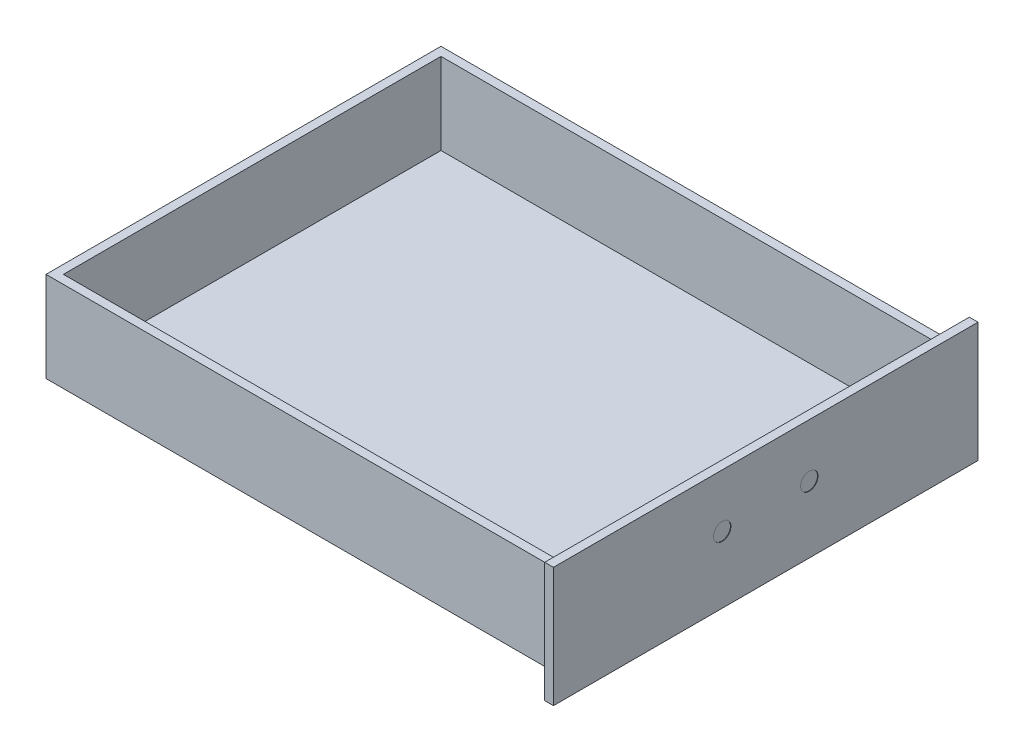
ISO-10303-21;
HEADER;
FILE_DESCRIPTION(('STEP AP214'),'2;1');
FILE_NAME('part.step','',(''),(''),'','','');
FILE_SCHEMA(('AUTOMOTIVE_DESIGN { 1 0 10303 214 1 1 1 1 }'));
ENDSEC;
DATA;
#1=APPLICATION_CONTEXT('core data for automotive mechanical design processes');
#2=APPLICATION_PROTOCOL_DEFINITION('international standard','automotive_design',2000,#1);
#3=PRODUCT_CONTEXT('',#1,'mechanical');
#4=PRODUCT('Part','Part','',(#3));
#5=PRODUCT_RELATED_PRODUCT_CATEGORY('part','',(#4));
#6=PRODUCT_DEFINITION_FORMATION('','',#4);
#7=PRODUCT_DEFINITION_CONTEXT('part definition',#1,'design');
#8=PRODUCT_DEFINITION('design','',#6,#7);
#9=PRODUCT_DEFINITION_SHAPE('','',#8);
#10=(LENGTH_UNIT() NAMED_UNIT(*) SI_UNIT(.MILLI.,.METRE.));
#11=(NAMED_UNIT(*) PLANE_ANGLE_UNIT() SI_UNIT($,.RADIAN.));
#12=(NAMED_UNIT(*) SI_UNIT($,.STERADIAN.) SOLID_ANGLE_UNIT());
#13=UNCERTAINTY_MEASURE_WITH_UNIT(LENGTH_MEASURE(1.E-05),#10,'distance_accuracy_value','');
#14=(GEOMETRIC_REPRESENTATION_CONTEXT(3) GLOBAL_UNCERTAINTY_ASSIGNED_CONTEXT((#13)) GLOBAL_UNIT_ASSIGNED_CONTEXT((#10,
#11,#12)) REPRESENTATION_CONTEXT('',''));
#15=CARTESIAN_POINT('',(0.,0.,0.));
#16=DIRECTION('',(0.,0.,1.));
#17=DIRECTION('',(1.,0.,0.));
#18=AXIS2_PLACEMENT_3D('',#15,#16,#17);
#19=CARTESIAN_POINT('',(-600.,1.89241402487911E-12,-340.907003891051));
#20=DIRECTION('',(0.,0.,-1.));
#21=DIRECTION('',(0.,1.,0.));
#22=AXIS2_PLACEMENT_3D('',#19,#20,#21);
#23=PLANE('',#22);
#24=DIRECTION('',(0.,1.,0.));
#25=VECTOR('',#24,1.);
#26=CARTESIAN_POINT('',(-590.,1.89241402487911E-12,-340.907003891051));
#27=LINE('',#26,#25);
#28=CARTESIAN_POINT('',(-590.,-49.5165369649805,-340.907003891051));
#29=VERTEX_POINT('',#28);
#30=CARTESIAN_POINT('',(-590.,44.1834630350195,-340.907003891051));
#31=VERTEX_POINT('',#30);
#32=EDGE_CURVE('E137',#29,#31,#27,.T.);
#33=ORIENTED_EDGE('',*,*,#32,.F.);
#34=DIRECTION('',(1.,0.,0.));
#35=VECTOR('',#34,1.);
#36=CARTESIAN_POINT('',(-600.,-49.5165369649805,-340.907003891051));
#37=LINE('',#36,#35);
#38=CARTESIAN_POINT('',(-10.,-49.5165369649805,-340.907003891051));
#39=VERTEX_POINT('',#38);
#40=EDGE_CURVE('E57',#29,#39,#37,.T.);
#41=ORIENTED_EDGE('',*,*,#40,.T.);
#42=DIRECTION('',(0.,1.,0.));
#43=VECTOR('',#42,1.);
#44=CARTESIAN_POINT('',(-10.,44.1834630350195,-340.907003891051));
#45=LINE('',#44,#43);
#46=CARTESIAN_POINT('',(-9.9999999999999,44.1834630350195,-340.90700389105));
#47=VERTEX_POINT('',#46);
#48=EDGE_CURVE('E263',#39,#47,#45,.T.);
#49=ORIENTED_EDGE('',*,*,#48,.T.);
#50=DIRECTION('',(1.,0.,0.));
#51=VECTOR('',#50,1.);
#52=CARTESIAN_POINT('',(-600.,44.1834630350195,-340.907003891051));
#53=LINE('',#52,#51);
#54=EDGE_CURVE('E164',#31,#47,#53,.T.);
#55=ORIENTED_EDGE('',*,*,#54,.F.);
#56=EDGE_LOOP('',(#33,#41,#49,#55));
#57=FACE_BOUND('',#56,.T.);
#58=ADVANCED_FACE('F40',(#57),#23,.F.);
#59=CARTESIAN_POINT('',(-600.,0.,92.8929961089494));
#60=DIRECTION('',(0.,0.,1.));
#61=DIRECTION('',(0.,-1.,0.));
#62=AXIS2_PLACEMENT_3D('',#59,#60,#61);
#63=PLANE('',#62);
#64=DIRECTION('',(0.,-1.,0.));
#65=VECTOR('',#64,1.);
#66=CARTESIAN_POINT('',(-590.,0.,92.8929961089494));
#67=LINE('',#66,#65);
#68=CARTESIAN_POINT('',(-590.,44.1834630350195,92.8929961089493));
#69=VERTEX_POINT('',#68);
#70=CARTESIAN_POINT('',(-590.,-49.5165369649805,92.8929961089494));
#71=VERTEX_POINT('',#70);
#72=EDGE_CURVE('E135',#69,#71,#67,.T.);
#73=ORIENTED_EDGE('',*,*,#72,.F.);
#74=DIRECTION('',(1.,0.,0.));
#75=VECTOR('',#74,1.);
#76=CARTESIAN_POINT('',(-600.,44.1834630350195,92.8929961089494));
#77=LINE('',#76,#75);
#78=CARTESIAN_POINT('',(-9.9999999999999,44.1834630350195,92.8929961089494));
#79=VERTEX_POINT('',#78);
#80=EDGE_CURVE('E65',#69,#79,#77,.T.);
#81=ORIENTED_EDGE('',*,*,#80,.T.);
#82=DIRECTION('',(0.,-1.,0.));
#83=VECTOR('',#82,1.);
#84=CARTESIAN_POINT('',(-10.,44.1834630350195,92.8929961089494));
#85=LINE('',#84,#83);
#86=CARTESIAN_POINT('',(-10.,-49.5165369649805,92.8929961089494));
#87=VERTEX_POINT('',#86);
#88=EDGE_CURVE('E259',#79,#87,#85,.T.);
#89=ORIENTED_EDGE('',*,*,#88,.T.);
#90=DIRECTION('',(1.,0.,0.));
#91=VECTOR('',#90,1.);
#92=CARTESIAN_POINT('',(-600.,-49.5165369649805,92.8929961089494));
#93=LINE('',#92,#91);
#94=EDGE_CURVE('E145',#71,#87,#93,.T.);
#95=ORIENTED_EDGE('',*,*,#94,.F.);
#96=EDGE_LOOP('',(#73,#81,#89,#95));
#97=FACE_BOUND('',#96,.T.);
#98=ADVANCED_FACE('F144',(#97),#63,.F.);
#99=CARTESIAN_POINT('',(-600.,-49.5165369649805,0.));
#100=DIRECTION('',(0.,-1.,0.));
#101=DIRECTION('',(0.,0.,-1.));
#102=AXIS2_PLACEMENT_3D('',#99,#100,#101);
#103=PLANE('',#102);
#104=DIRECTION('',(0.,0.,-1.));
#105=VECTOR('',#104,1.);
#106=CARTESIAN_POINT('',(-590.,-49.5165369649805,0.));
#107=LINE('',#106,#105);
#108=EDGE_CURVE('E140',#71,#29,#107,.T.);
#109=ORIENTED_EDGE('',*,*,#108,.F.);
#110=ORIENTED_EDGE('',*,*,#94,.T.);
#111=DIRECTION('',(0.,0.,-1.));
#112=VECTOR('',#111,1.);
#113=CARTESIAN_POINT('',(-10.,-49.5165369649805,92.8929961089494));
#114=LINE('',#113,#112);
#115=EDGE_CURVE('E261',#87,#39,#114,.T.);
#116=ORIENTED_EDGE('',*,*,#115,.T.);
#117=ORIENTED_EDGE('',*,*,#40,.F.);
#118=EDGE_LOOP('',(#109,#110,#116,#117));
#119=FACE_BOUND('',#118,.T.);
#120=ADVANCED_FACE('F229',(#119),#103,.F.);
#121=CARTESIAN_POINT('',(-9.9999999999999,61.1834630350195,119.892996108949));
#122=DIRECTION('',(0.,0.,1.));
#123=DIRECTION('',(1.,0.,0.));
#124=AXIS2_PLACEMENT_3D('',#121,#122,#123);
#125=PLANE('',#124);
#126=DIRECTION('',(0.,-1.,0.));
#127=VECTOR('',#126,1.);
#128=CARTESIAN_POINT('',(0.,61.1834630350195,119.892996108949));
#129=LINE('',#128,#127);
#130=CARTESIAN_POINT('',(0.,61.1834630350195,119.892996108949));
#131=VERTEX_POINT('',#130);
#132=CARTESIAN_POINT('',(0.,-76.5165369649805,119.892996108949));
#133=VERTEX_POINT('',#132);
#134=EDGE_CURVE('E173',#131,#133,#129,.T.);
#135=ORIENTED_EDGE('',*,*,#134,.F.);
#136=DIRECTION('',(1.,0.,0.));
#137=VECTOR('',#136,1.);
#138=CARTESIAN_POINT('',(-9.9999999999999,61.1834630350195,119.892996108949));
#139=LINE('',#138,#137);
#140=CARTESIAN_POINT('',(-9.9999999999999,61.1834630350195,119.892996108949));
#141=VERTEX_POINT('',#140);
#142=EDGE_CURVE('E11',#141,#131,#139,.T.);
#143=ORIENTED_EDGE('',*,*,#142,.F.);
#144=DIRECTION('',(0.,-1.,0.));
#145=VECTOR('',#144,1.);
#146=CARTESIAN_POINT('',(-9.9999999999999,61.1834630350195,119.892996108949));
#147=LINE('',#146,#145);
#148=CARTESIAN_POINT('',(-9.9999999999999,-76.5165369649805,119.892996108949));
#149=VERTEX_POINT('',#148);
#150=EDGE_CURVE('E174',#141,#149,#147,.T.);
#151=ORIENTED_EDGE('',*,*,#150,.T.);
#152=DIRECTION('',(1.,0.,0.));
#153=VECTOR('',#152,1.);
#154=CARTESIAN_POINT('',(-9.9999999999999,-76.5165369649805,119.892996108949));
#155=LINE('',#154,#153);
#156=EDGE_CURVE('E44',#149,#133,#155,.T.);
#157=ORIENTED_EDGE('',*,*,#156,.T.);
#158=EDGE_LOOP('',(#135,#143,#151,#157));
#159=FACE_BOUND('',#158,.T.);
#160=ADVANCED_FACE('F42',(#159),#125,.T.);
#161=CARTESIAN_POINT('',(-9.9999999999999,61.1834630350195,119.892996108949));
#162=DIRECTION('',(0.,1.,0.));
#163=DIRECTION('',(0.,0.,1.));
#164=AXIS2_PLACEMENT_3D('',#161,#162,#163);
#165=PLANE('',#164);
#166=DIRECTION('',(0.,0.,1.));
#167=VECTOR('',#166,1.);
#168=CARTESIAN_POINT('',(0.,61.1834630350195,119.892996108949));
#169=LINE('',#168,#167);
#170=CARTESIAN_POINT('',(0.,61.1834630350195,-367.907003891051));
#171=VERTEX_POINT('',#170);
#172=EDGE_CURVE('E178',#171,#131,#169,.T.);
#173=ORIENTED_EDGE('',*,*,#172,.F.);
#174=DIRECTION('',(1.,0.,0.));
#175=VECTOR('',#174,1.);
#176=CARTESIAN_POINT('',(-9.9999999999999,61.1834630350195,-367.907003891051));
#177=LINE('',#176,#175);
#178=CARTESIAN_POINT('',(-9.9999999999999,61.1834630350195,-367.907003891051));
#179=VERTEX_POINT('',#178);
#180=EDGE_CURVE('E49',#179,#171,#177,.T.);
#181=ORIENTED_EDGE('',*,*,#180,.F.);
#182=DIRECTION('',(0.,0.,1.));
#183=VECTOR('',#182,1.);
#184=CARTESIAN_POINT('',(-9.9999999999999,61.1834630350195,119.892996108949));
#185=LINE('',#184,#183);
#186=EDGE_CURVE('E184',#179,#141,#185,.T.);
#187=ORIENTED_EDGE('',*,*,#186,.T.);
#188=ORIENTED_EDGE('',*,*,#142,.T.);
#189=EDGE_LOOP('',(#173,#181,#187,#188));
#190=FACE_BOUND('',#189,.T.);
#191=ADVANCED_FACE('F210',(#190),#165,.T.);
#192=CARTESIAN_POINT('',(-9.9999999999999,61.1834630350195,-367.907003891051));
#193=DIRECTION('',(0.,0.,-1.));
#194=DIRECTION('',(-1.,0.,0.));
#195=AXIS2_PLACEMENT_3D('',#192,#193,#194);
#196=PLANE('',#195);
#197=DIRECTION('',(0.,1.,0.));
#198=VECTOR('',#197,1.);
#199=CARTESIAN_POINT('',(0.,61.1834630350195,-367.907003891051));
#200=LINE('',#199,#198);
#201=CARTESIAN_POINT('',(0.,-76.5165369649805,-367.907003891051));
#202=VERTEX_POINT('',#201);
#203=EDGE_CURVE('E192',#202,#171,#200,.T.);
#204=ORIENTED_EDGE('',*,*,#203,.F.);
#205=DIRECTION('',(1.,0.,0.));
#206=VECTOR('',#205,1.);
#207=CARTESIAN_POINT('',(-9.9999999999999,-76.5165369649805,-367.907003891051));
#208=LINE('',#207,#206);
#209=CARTESIAN_POINT('',(-9.9999999999999,-76.5165369649805,-367.907003891051));
#210=VERTEX_POINT('',#209);
#211=EDGE_CURVE('E197',#210,#202,#208,.T.);
#212=ORIENTED_EDGE('',*,*,#211,.F.);
#213=DIRECTION('',(0.,1.,0.));
#214=VECTOR('',#213,1.);
#215=CARTESIAN_POINT('',(-9.9999999999999,61.1834630350195,-367.907003891051));
#216=LINE('',#215,#214);
#217=EDGE_CURVE('E181',#210,#179,#216,.T.);
#218=ORIENTED_EDGE('',*,*,#217,.T.);
#219=ORIENTED_EDGE('',*,*,#180,.T.);
#220=EDGE_LOOP('',(#204,#212,#218,#219));
#221=FACE_BOUND('',#220,.T.);
#222=ADVANCED_FACE('F216',(#221),#196,.T.);
#223=CARTESIAN_POINT('',(-9.9999999999999,-76.5165369649805,119.892996108949));
#224=DIRECTION('',(0.,-1.,0.));
#225=DIRECTION('',(0.,0.,-1.));
#226=AXIS2_PLACEMENT_3D('',#223,#224,#225);
#227=PLANE('',#226);
#228=DIRECTION('',(0.,0.,-1.));
#229=VECTOR('',#228,1.);
#230=CARTESIAN_POINT('',(0.,-76.5165369649805,119.892996108949));
#231=LINE('',#230,#229);
#232=EDGE_CURVE('E189',#133,#202,#231,.T.);
#233=ORIENTED_EDGE('',*,*,#232,.F.);
#234=ORIENTED_EDGE('',*,*,#156,.F.);
#235=DIRECTION('',(0.,0.,-1.));
#236=VECTOR('',#235,1.);
#237=CARTESIAN_POINT('',(-9.9999999999999,-76.5165369649805,119.892996108949));
#238=LINE('',#237,#236);
#239=EDGE_CURVE('E177',#149,#210,#238,.T.);
#240=ORIENTED_EDGE('',*,*,#239,.T.);
#241=ORIENTED_EDGE('',*,*,#211,.T.);
#242=EDGE_LOOP('',(#233,#234,#240,#241));
#243=FACE_BOUND('',#242,.T.);
#244=ADVANCED_FACE('F205',(#243),#227,.T.);
#245=CARTESIAN_POINT('',(-9.9999999999999,0.,0.));
#246=DIRECTION('',(1.,0.,0.));
#247=DIRECTION('',(0.,0.,-1.));
#248=AXIS2_PLACEMENT_3D('',#245,#246,#247);
#249=PLANE('',#248);
#250=DIRECTION('',(0.,0.,1.));
#251=VECTOR('',#250,1.);
#252=CARTESIAN_POINT('',(-9.9999999999999,44.1834630350195,102.892996108949));
#253=LINE('',#252,#251);
#254=CARTESIAN_POINT('',(-9.9999999999999,44.1834630350195,-350.907003891051));
#255=VERTEX_POINT('',#254);
#256=EDGE_CURVE('E170',#255,#47,#253,.T.);
#257=ORIENTED_EDGE('',*,*,#256,.T.);
#258=ORIENTED_EDGE('',*,*,#48,.F.);
#259=ORIENTED_EDGE('',*,*,#115,.F.);
#260=ORIENTED_EDGE('',*,*,#88,.F.);
#261=CARTESIAN_POINT('',(-9.9999999999999,44.1834630350195,102.892996108949));
#262=VERTEX_POINT('',#261);
#263=EDGE_CURVE('E149',#79,#262,#253,.T.);
#264=ORIENTED_EDGE('',*,*,#263,.T.);
#265=DIRECTION('',(0.,-1.,0.));
#266=VECTOR('',#265,1.);
#267=CARTESIAN_POINT('',(-9.9999999999999,44.1834630350195,102.892996108949));
#268=LINE('',#267,#266);
#269=CARTESIAN_POINT('',(-9.9999999999999,-59.5165369649805,102.892996108949));
#270=VERTEX_POINT('',#269);
#271=EDGE_CURVE('E160',#262,#270,#268,.T.);
#272=ORIENTED_EDGE('',*,*,#271,.T.);
#273=DIRECTION('',(0.,0.,-1.));
#274=VECTOR('',#273,1.);
#275=CARTESIAN_POINT('',(-9.9999999999999,-59.5165369649805,102.892996108949));
#276=LINE('',#275,#274);
#277=CARTESIAN_POINT('',(-9.9999999999999,-59.5165369649805,-350.907003891051));
#278=VERTEX_POINT('',#277);
#279=EDGE_CURVE('E163',#270,#278,#276,.T.);
#280=ORIENTED_EDGE('',*,*,#279,.T.);
#281=DIRECTION('',(0.,1.,0.));
#282=VECTOR('',#281,1.);
#283=CARTESIAN_POINT('',(-9.9999999999999,44.1834630350195,-350.907003891051));
#284=LINE('',#283,#282);
#285=EDGE_CURVE('E167',#278,#255,#284,.T.);
#286=ORIENTED_EDGE('',*,*,#285,.T.);
#287=EDGE_LOOP('',(#257,#258,#259,#260,#264,#272,#280,#286));
#288=FACE_BOUND('',#287,.T.);
#289=ORIENTED_EDGE('',*,*,#150,.F.);
#290=ORIENTED_EDGE('',*,*,#186,.F.);
#291=ORIENTED_EDGE('',*,*,#217,.F.);
#292=ORIENTED_EDGE('',*,*,#239,.F.);
#293=EDGE_LOOP('',(#289,#290,#291,#292));
#294=FACE_BOUND('',#293,.T.);
#295=ADVANCED_FACE('F213',(#288,#294),#249,.F.);
#296=CARTESIAN_POINT('',(0.,0.,0.));
#297=DIRECTION('',(1.,0.,0.));
#298=DIRECTION('',(0.,0.,-1.));
#299=AXIS2_PLACEMENT_3D('',#296,#297,#298);
#300=PLANE('',#299);
#301=CARTESIAN_POINT('',(0.,0.,-74.0070038910507));
#302=DIRECTION('',(1.,0.,0.));
#303=DIRECTION('',(0.,0.,-1.));
#304=AXIS2_PLACEMENT_3D('',#301,#302,#303);
#305=CIRCLE('',#304,9.99999999999999);
#306=CARTESIAN_POINT('',(0.,0.,-84.0070038910507));
#307=VERTEX_POINT('',#306);
#308=EDGE_CURVE('E246',#307,#307,#305,.T.);
#309=ORIENTED_EDGE('',*,*,#308,.F.);
#310=EDGE_LOOP('',(#309));
#311=FACE_BOUND('',#310,.T.);
#312=CARTESIAN_POINT('',(0.,0.,-174.007003891051));
#313=DIRECTION('',(1.,0.,0.));
#314=DIRECTION('',(0.,0.,-1.));
#315=AXIS2_PLACEMENT_3D('',#312,#313,#314);
#316=CIRCLE('',#315,10.);
#317=CARTESIAN_POINT('',(0.,0.,-184.007003891051));
#318=VERTEX_POINT('',#317);
#319=EDGE_CURVE('E249',#318,#318,#316,.T.);
#320=ORIENTED_EDGE('',*,*,#319,.F.);
#321=EDGE_LOOP('',(#320));
#322=FACE_BOUND('',#321,.T.);
#323=ORIENTED_EDGE('',*,*,#134,.T.);
#324=ORIENTED_EDGE('',*,*,#232,.T.);
#325=ORIENTED_EDGE('',*,*,#203,.T.);
#326=ORIENTED_EDGE('',*,*,#172,.T.);
#327=EDGE_LOOP('',(#323,#324,#325,#326));
#328=FACE_BOUND('',#327,.T.);
#329=ADVANCED_FACE('F207',(#311,#322,#328),#300,.T.);
#330=CARTESIAN_POINT('',(-600.,44.1834630350195,0.));
#331=DIRECTION('',(0.,-1.,0.));
#332=DIRECTION('',(0.,0.,-1.));
#333=AXIS2_PLACEMENT_3D('',#330,#331,#332);
#334=PLANE('',#333);
#335=DIRECTION('',(1.,0.,0.));
#336=VECTOR('',#335,1.);
#337=CARTESIAN_POINT('',(-600.,44.1834630350195,102.892996108949));
#338=LINE('',#337,#336);
#339=CARTESIAN_POINT('',(-600.,44.1834630350195,102.892996108949));
#340=VERTEX_POINT('',#339);
#341=EDGE_CURVE('E151',#340,#262,#338,.T.);
#342=ORIENTED_EDGE('',*,*,#341,.T.);
#343=ORIENTED_EDGE('',*,*,#263,.F.);
#344=ORIENTED_EDGE('',*,*,#80,.F.);
#345=DIRECTION('',(0.,0.,-1.));
#346=VECTOR('',#345,1.);
#347=CARTESIAN_POINT('',(-590.,44.1834630350195,-350.907003891051));
#348=LINE('',#347,#346);
#349=EDGE_CURVE('E133',#69,#31,#348,.T.);
#350=ORIENTED_EDGE('',*,*,#349,.T.);
#351=ORIENTED_EDGE('',*,*,#54,.T.);
#352=ORIENTED_EDGE('',*,*,#256,.F.);
#353=DIRECTION('',(1.,0.,0.));
#354=VECTOR('',#353,1.);
#355=CARTESIAN_POINT('',(-600.,44.1834630350195,-350.907003891051));
#356=LINE('',#355,#354);
#357=CARTESIAN_POINT('',(-600.,44.1834630350195,-350.907003891051));
#358=VERTEX_POINT('',#357);
#359=EDGE_CURVE('E274',#358,#255,#356,.T.);
#360=ORIENTED_EDGE('',*,*,#359,.F.);
#361=DIRECTION('',(0.,0.,-1.));
#362=VECTOR('',#361,1.);
#363=CARTESIAN_POINT('',(-600.,44.1834630350195,0.));
#364=LINE('',#363,#362);
#365=EDGE_CURVE('E159',#340,#358,#364,.T.);
#366=ORIENTED_EDGE('',*,*,#365,.F.);
#367=EDGE_LOOP('',(#342,#343,#344,#350,#351,#352,#360,#366));
#368=FACE_BOUND('',#367,.T.);
#369=ADVANCED_FACE('F147',(#368),#334,.F.);
#370=CARTESIAN_POINT('',(-600.,-59.5165369649805,0.));
#371=DIRECTION('',(0.,1.,0.));
#372=DIRECTION('',(0.,0.,1.));
#373=AXIS2_PLACEMENT_3D('',#370,#371,#372);
#374=PLANE('',#373);
#375=DIRECTION('',(1.,0.,0.));
#376=VECTOR('',#375,1.);
#377=CARTESIAN_POINT('',(-600.,-59.5165369649805,-350.907003891051));
#378=LINE('',#377,#376);
#379=CARTESIAN_POINT('',(-600.,-59.5165369649805,-350.907003891051));
#380=VERTEX_POINT('',#379);
#381=EDGE_CURVE('E276',#380,#278,#378,.T.);
#382=ORIENTED_EDGE('',*,*,#381,.T.);
#383=ORIENTED_EDGE('',*,*,#279,.F.);
#384=DIRECTION('',(1.,0.,0.));
#385=VECTOR('',#384,1.);
#386=CARTESIAN_POINT('',(-600.,-59.5165369649805,102.892996108949));
#387=LINE('',#386,#385);
#388=CARTESIAN_POINT('',(-600.,-59.5165369649805,102.892996108949));
#389=VERTEX_POINT('',#388);
#390=EDGE_CURVE('E153',#389,#270,#387,.T.);
#391=ORIENTED_EDGE('',*,*,#390,.F.);
#392=DIRECTION('',(0.,0.,1.));
#393=VECTOR('',#392,1.);
#394=CARTESIAN_POINT('',(-600.,-59.5165369649805,0.));
#395=LINE('',#394,#393);
#396=EDGE_CURVE('E270',#380,#389,#395,.T.);
#397=ORIENTED_EDGE('',*,*,#396,.F.);
#398=EDGE_LOOP('',(#382,#383,#391,#397));
#399=FACE_BOUND('',#398,.T.);
#400=ADVANCED_FACE('F241',(#399),#374,.F.);
#401=CARTESIAN_POINT('',(-600.,0.,-350.907003891051));
#402=DIRECTION('',(0.,0.,1.));
#403=DIRECTION('',(1.,0.,0.));
#404=AXIS2_PLACEMENT_3D('',#401,#402,#403);
#405=PLANE('',#404);
#406=ORIENTED_EDGE('',*,*,#359,.T.);
#407=ORIENTED_EDGE('',*,*,#285,.F.);
#408=ORIENTED_EDGE('',*,*,#381,.F.);
#409=DIRECTION('',(0.,-1.,0.));
#410=VECTOR('',#409,1.);
#411=CARTESIAN_POINT('',(-600.,0.,-350.907003891051));
#412=LINE('',#411,#410);
#413=EDGE_CURVE('E267',#358,#380,#412,.T.);
#414=ORIENTED_EDGE('',*,*,#413,.F.);
#415=EDGE_LOOP('',(#406,#407,#408,#414));
#416=FACE_BOUND('',#415,.T.);
#417=ADVANCED_FACE('F290',(#416),#405,.F.);
#418=CARTESIAN_POINT('',(-600.,0.,102.892996108949));
#419=DIRECTION('',(0.,0.,-1.));
#420=DIRECTION('',(-1.,0.,0.));
#421=AXIS2_PLACEMENT_3D('',#418,#419,#420);
#422=PLANE('',#421);
#423=ORIENTED_EDGE('',*,*,#390,.T.);
#424=ORIENTED_EDGE('',*,*,#271,.F.);
#425=ORIENTED_EDGE('',*,*,#341,.F.);
#426=DIRECTION('',(0.,1.,0.));
#427=VECTOR('',#426,1.);
#428=CARTESIAN_POINT('',(-600.,0.,102.892996108949));
#429=LINE('',#428,#427);
#430=EDGE_CURVE('E265',#389,#340,#429,.T.);
#431=ORIENTED_EDGE('',*,*,#430,.F.);
#432=EDGE_LOOP('',(#423,#424,#425,#431));
#433=FACE_BOUND('',#432,.T.);
#434=ADVANCED_FACE('F281',(#433),#422,.F.);
#435=CARTESIAN_POINT('',(-600.,0.,0.));
#436=DIRECTION('',(1.,0.,0.));
#437=DIRECTION('',(0.,0.,-1.));
#438=AXIS2_PLACEMENT_3D('',#435,#436,#437);
#439=PLANE('',#438);
#440=ORIENTED_EDGE('',*,*,#430,.T.);
#441=ORIENTED_EDGE('',*,*,#365,.T.);
#442=ORIENTED_EDGE('',*,*,#413,.T.);
#443=ORIENTED_EDGE('',*,*,#396,.T.);
#444=EDGE_LOOP('',(#440,#441,#442,#443));
#445=FACE_BOUND('',#444,.T.);
#446=ADVANCED_FACE('F378',(#445),#439,.F.);
#447=CARTESIAN_POINT('',(-590.,0.,0.));
#448=DIRECTION('',(-1.,0.,0.));
#449=DIRECTION('',(0.,0.,1.));
#450=AXIS2_PLACEMENT_3D('',#447,#448,#449);
#451=PLANE('',#450);
#452=ORIENTED_EDGE('',*,*,#108,.T.);
#453=ORIENTED_EDGE('',*,*,#32,.T.);
#454=ORIENTED_EDGE('',*,*,#349,.F.);
#455=ORIENTED_EDGE('',*,*,#72,.T.);
#456=EDGE_LOOP('',(#452,#453,#454,#455));
#457=FACE_BOUND('',#456,.T.);
#458=ADVANCED_FACE('F134',(#457),#451,.F.);
#459=CARTESIAN_POINT('',(-0.5,0.,-174.007003891051));
#460=DIRECTION('',(1.,0.,0.));
#461=DIRECTION('',(0.,0.,-1.));
#462=AXIS2_PLACEMENT_3D('',#459,#460,#461);
#463=CYLINDRICAL_SURFACE('',#462,10.);
#464=CARTESIAN_POINT('',(-0.5,0.,-174.007003891051));
#465=DIRECTION('',(1.,0.,0.));
#466=DIRECTION('',(0.,0.,-1.));
#467=AXIS2_PLACEMENT_3D('',#464,#465,#466);
#468=CIRCLE('',#467,10.);
#469=CARTESIAN_POINT('',(-0.5,0.,-184.007003891051));
#470=VERTEX_POINT('',#469);
#471=EDGE_CURVE('E251',#470,#470,#468,.T.);
#472=ORIENTED_EDGE('',*,*,#471,.F.);
#473=EDGE_LOOP('',(#472));
#474=FACE_BOUND('',#473,.T.);
#475=ORIENTED_EDGE('',*,*,#319,.T.);
#476=EDGE_LOOP('',(#475));
#477=FACE_BOUND('',#476,.T.);
#478=ADVANCED_FACE('F394',(#474,#477),#463,.F.);
#479=CARTESIAN_POINT('',(-0.5,0.,-174.007003891051));
#480=DIRECTION('',(1.,0.,0.));
#481=DIRECTION('',(0.,0.,-1.));
#482=AXIS2_PLACEMENT_3D('',#479,#480,#481);
#483=PLANE('',#482);
#484=ORIENTED_EDGE('',*,*,#471,.T.);
#485=EDGE_LOOP('',(#484));
#486=FACE_BOUND('',#485,.T.);
#487=ADVANCED_FACE('F408',(#486),#483,.T.);
#488=CARTESIAN_POINT('',(-0.5,0.,-74.0070038910507));
#489=DIRECTION('',(1.,0.,0.));
#490=DIRECTION('',(0.,0.,-1.));
#491=AXIS2_PLACEMENT_3D('',#488,#489,#490);
#492=CYLINDRICAL_SURFACE('',#491,9.99999999999999);
#493=CARTESIAN_POINT('',(-0.5,0.,-74.0070038910507));
#494=DIRECTION('',(1.,0.,0.));
#495=DIRECTION('',(0.,0.,-1.));
#496=AXIS2_PLACEMENT_3D('',#493,#494,#495);
#497=CIRCLE('',#496,9.99999999999999);
#498=CARTESIAN_POINT('',(-0.5,0.,-84.0070038910507));
#499=VERTEX_POINT('',#498);
#500=EDGE_CURVE('E141',#499,#499,#497,.T.);
#501=ORIENTED_EDGE('',*,*,#500,.F.);
#502=EDGE_LOOP('',(#501));
#503=FACE_BOUND('',#502,.T.);
#504=ORIENTED_EDGE('',*,*,#308,.T.);
#505=EDGE_LOOP('',(#504));
#506=FACE_BOUND('',#505,.T.);
#507=ADVANCED_FACE('F418',(#503,#506),#492,.F.);
#508=CARTESIAN_POINT('',(-0.5,0.,-74.0070038910507));
#509=DIRECTION('',(1.,0.,0.));
#510=DIRECTION('',(0.,0.,-1.));
#511=AXIS2_PLACEMENT_3D('',#508,#509,#510);
#512=PLANE('',#511);
#513=ORIENTED_EDGE('',*,*,#500,.T.);
#514=EDGE_LOOP('',(#513));
#515=FACE_BOUND('',#514,.T.);
#516=ADVANCED_FACE('F428',(#515),#512,.T.);
#517=CLOSED_SHELL('',(#58,#98,#120,#160,#191,#222,#244,#295,#329,#369,#400,#417,#434,#446,#458,
#478,#487,#507,#516));
#518=MANIFOLD_SOLID_BREP('B2',#517);
#519=ADVANCED_BREP_SHAPE_REPRESENTATION('',(#18,#518),#14);
#520=SHAPE_DEFINITION_REPRESENTATION(#9,#519);
ENDSEC;
END-ISO-10303-21;
